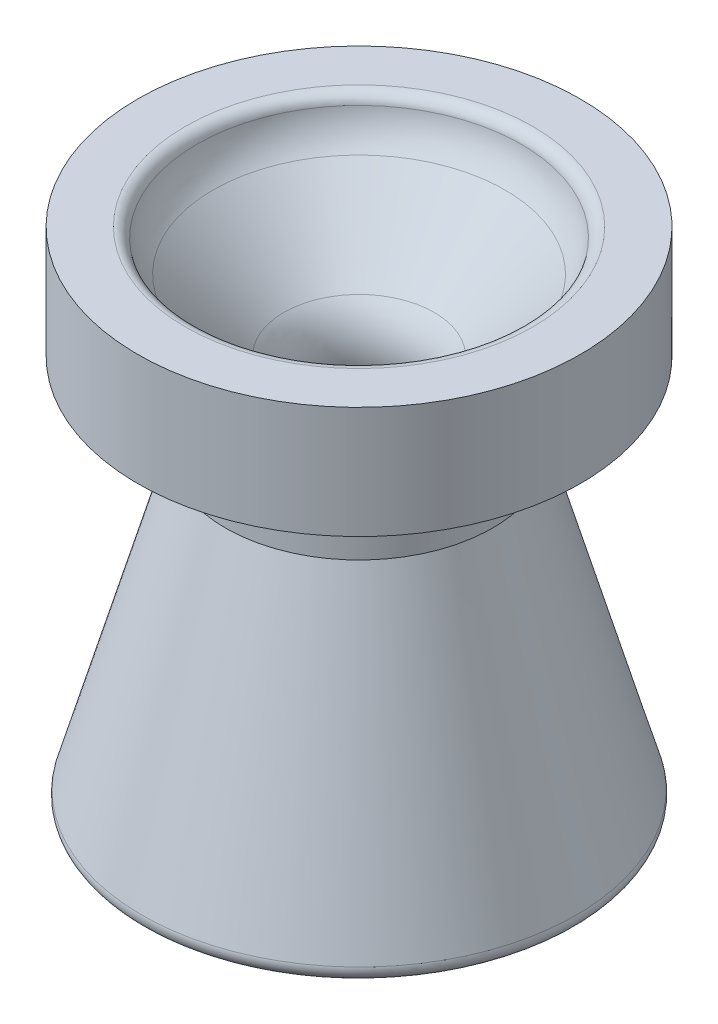
ISO-10303-21;
HEADER;
FILE_DESCRIPTION(('STEP AP214'),'2;1');
FILE_NAME('part.step','',(''),(''),'','','');
FILE_SCHEMA(('AUTOMOTIVE_DESIGN { 1 0 10303 214 1 1 1 1 }'));
ENDSEC;
DATA;
#1=APPLICATION_CONTEXT('core data for automotive mechanical design processes');
#2=APPLICATION_PROTOCOL_DEFINITION('international standard','automotive_design',2000,#1);
#3=PRODUCT_CONTEXT('',#1,'mechanical');
#4=PRODUCT('Part','Part','',(#3));
#5=PRODUCT_RELATED_PRODUCT_CATEGORY('part','',(#4));
#6=PRODUCT_DEFINITION_FORMATION('','',#4);
#7=PRODUCT_DEFINITION_CONTEXT('part definition',#1,'design');
#8=PRODUCT_DEFINITION('design','',#6,#7);
#9=PRODUCT_DEFINITION_SHAPE('','',#8);
#10=(LENGTH_UNIT() NAMED_UNIT(*) SI_UNIT(.MILLI.,.METRE.));
#11=(NAMED_UNIT(*) PLANE_ANGLE_UNIT() SI_UNIT($,.RADIAN.));
#12=(NAMED_UNIT(*) SI_UNIT($,.STERADIAN.) SOLID_ANGLE_UNIT());
#13=UNCERTAINTY_MEASURE_WITH_UNIT(LENGTH_MEASURE(1.E-05),#10,'distance_accuracy_value','');
#14=(GEOMETRIC_REPRESENTATION_CONTEXT(3) GLOBAL_UNCERTAINTY_ASSIGNED_CONTEXT((#13)) GLOBAL_UNIT_ASSIGNED_CONTEXT((#10,
#11,#12)) REPRESENTATION_CONTEXT('',''));
#15=CARTESIAN_POINT('',(0.,0.,0.));
#16=DIRECTION('',(0.,0.,1.));
#17=DIRECTION('',(1.,0.,0.));
#18=AXIS2_PLACEMENT_3D('',#15,#16,#17);
#19=CARTESIAN_POINT('',(0.,-38.1,0.));
#20=DIRECTION('',(0.,1.,0.));
#21=DIRECTION('',(-1.,0.,0.));
#22=AXIS2_PLACEMENT_3D('',#19,#20,#21);
#23=PLANE('',#22);
#24=CARTESIAN_POINT('',(12.7,-38.1,0.));
#25=DIRECTION('',(0.,1.,0.));
#26=DIRECTION('',(-1.,0.,0.));
#27=AXIS2_PLACEMENT_3D('',#24,#25,#26);
#28=CIRCLE('',#27,22.4478970940788);
#29=CARTESIAN_POINT('',(-9.74789709407875,-38.1,0.));
#30=VERTEX_POINT('',#29);
#31=EDGE_CURVE('E10',#30,#30,#28,.F.);
#32=ORIENTED_EDGE('',*,*,#31,.T.);
#33=EDGE_LOOP('',(#32));
#34=FACE_BOUND('',#33,.T.);
#35=CARTESIAN_POINT('',(12.7,-38.1,0.));
#36=DIRECTION('',(0.,1.,0.));
#37=DIRECTION('',(-1.,0.,0.));
#38=AXIS2_PLACEMENT_3D('',#35,#36,#37);
#39=CIRCLE('',#38,17.78);
#40=CARTESIAN_POINT('',(-5.08,-38.1,0.));
#41=VERTEX_POINT('',#40);
#42=EDGE_CURVE('E69',#41,#41,#39,.T.);
#43=ORIENTED_EDGE('',*,*,#42,.T.);
#44=EDGE_LOOP('',(#43));
#45=FACE_BOUND('',#44,.T.);
#46=ADVANCED_FACE('F45',(#34,#45),#23,.F.);
#47=CARTESIAN_POINT('',(546348.662663891,-837588.934241711,0.));
#48=CARTESIAN_POINT('',(-551644.589808928,834072.325765746,0.));
#49=CARTESIAN_POINT('',(556971.334764745,-830563.154592408,0.));
#50=B_SPLINE_CURVE_WITH_KNOTS('',2,(#47,#48,#49),.UNSPECIFIED.,.F.,.F.,(3,3),(0.,1.),.UNSPECIFIED.);
#51=CARTESIAN_POINT('',(12.7,19.6493776314739,0.));
#52=DIRECTION('',(0.,1.,0.));
#53=AXIS1_PLACEMENT('',#51,#52);
#54=SURFACE_OF_REVOLUTION('',#50,#53);
#55=CARTESIAN_POINT('',(12.7,-4.49012806053458,0.));
#56=DIRECTION('',(0.,1.,0.));
#57=DIRECTION('',(-1.,0.,0.));
#58=AXIS2_PLACEMENT_3D('',#55,#56,#57);
#59=CIRCLE('',#58,8.20987193946543);
#60=CARTESIAN_POINT('',(4.49012806053457,-4.49012806053458,0.));
#61=VERTEX_POINT('',#60);
#62=EDGE_CURVE('E73',#61,#61,#59,.T.);
#63=ORIENTED_EDGE('',*,*,#62,.T.);
#64=EDGE_LOOP('',(#63));
#65=FACE_BOUND('',#64,.T.);
#66=ORIENTED_EDGE('',*,*,#42,.F.);
#67=EDGE_LOOP('',(#66));
#68=FACE_BOUND('',#67,.T.);
#69=ADVANCED_FACE('F108',(#65,#68),#54,.F.);
#70=CARTESIAN_POINT('',(12.7,0.,0.));
#71=DIRECTION('',(0.,1.,0.));
#72=DIRECTION('',(-1.,0.,0.));
#73=AXIS2_PLACEMENT_3D('',#70,#71,#72);
#74=TOROIDAL_SURFACE('',#73,12.7,6.35);
#75=ORIENTED_EDGE('',*,*,#62,.F.);
#76=EDGE_LOOP('',(#75));
#77=FACE_BOUND('',#76,.T.);
#78=CARTESIAN_POINT('',(12.7,4.49012806053459,0.));
#79=DIRECTION('',(0.,1.,0.));
#80=DIRECTION('',(-1.,0.,0.));
#81=AXIS2_PLACEMENT_3D('',#78,#79,#80);
#82=CIRCLE('',#81,8.20987193946543);
#83=CARTESIAN_POINT('',(4.49012806053457,4.49012806053458,0.));
#84=VERTEX_POINT('',#83);
#85=EDGE_CURVE('E77',#84,#84,#82,.T.);
#86=ORIENTED_EDGE('',*,*,#85,.T.);
#87=EDGE_LOOP('',(#86));
#88=FACE_BOUND('',#87,.T.);
#89=ADVANCED_FACE('F112',(#77,#88),#74,.T.);
#90=CARTESIAN_POINT('',(12.7,4.49012806053459,0.));
#91=DIRECTION('',(0.,1.,0.));
#92=DIRECTION('',(-1.,0.,0.));
#93=AXIS2_PLACEMENT_3D('',#90,#91,#92);
#94=CONICAL_SURFACE('',#93,8.20987193946543,0.785398163397451);
#95=CARTESIAN_POINT('',(12.7,12.2003841816037,0.));
#96=DIRECTION('',(0.,1.,0.));
#97=DIRECTION('',(-1.,0.,0.));
#98=AXIS2_PLACEMENT_3D('',#95,#96,#97);
#99=CIRCLE('',#98,15.9201280605346);
#100=CARTESIAN_POINT('',(-3.22012806053457,12.2003841816037,0.));
#101=VERTEX_POINT('',#100);
#102=EDGE_CURVE('E81',#101,#101,#99,.T.);
#103=ORIENTED_EDGE('',*,*,#102,.T.);
#104=EDGE_LOOP('',(#103));
#105=FACE_BOUND('',#104,.T.);
#106=ORIENTED_EDGE('',*,*,#85,.F.);
#107=EDGE_LOOP('',(#106));
#108=FACE_BOUND('',#107,.T.);
#109=ADVANCED_FACE('F135',(#105,#108),#94,.F.);
#110=CARTESIAN_POINT('',(12.7,16.6905122421383,0.));
#111=DIRECTION('',(0.,1.,0.));
#112=DIRECTION('',(-1.,0.,0.));
#113=AXIS2_PLACEMENT_3D('',#110,#111,#112);
#114=TOROIDAL_SURFACE('',#113,11.43,6.35);
#115=CARTESIAN_POINT('',(12.7,15.6321789088049,0.));
#116=DIRECTION('',(0.,1.,0.));
#117=DIRECTION('',(-1.,0.,0.));
#118=AXIS2_PLACEMENT_3D('',#115,#116,#117);
#119=CIRCLE('',#118,17.6911844371138);
#120=CARTESIAN_POINT('',(-4.99118443711376,15.6321789088049,0.));
#121=VERTEX_POINT('',#120);
#122=EDGE_CURVE('E63',#121,#121,#119,.T.);
#123=ORIENTED_EDGE('',*,*,#122,.T.);
#124=EDGE_LOOP('',(#123));
#125=FACE_BOUND('',#124,.T.);
#126=ORIENTED_EDGE('',*,*,#102,.F.);
#127=EDGE_LOOP('',(#126));
#128=FACE_BOUND('',#127,.T.);
#129=ADVANCED_FACE('F131',(#125,#128),#114,.F.);
#130=CARTESIAN_POINT('',(0.,16.6905122421383,0.));
#131=DIRECTION('',(0.,-1.,0.));
#132=DIRECTION('',(1.,0.,0.));
#133=AXIS2_PLACEMENT_3D('',#130,#131,#132);
#134=PLANE('',#133);
#135=CARTESIAN_POINT('',(12.7,16.6905122421383,0.));
#136=DIRECTION('',(0.,-1.,0.));
#137=DIRECTION('',(1.,0.,0.));
#138=AXIS2_PLACEMENT_3D('',#135,#136,#137);
#139=CIRCLE('',#138,18.9434213245365);
#140=CARTESIAN_POINT('',(31.6434213245365,16.6905122421383,0.));
#141=VERTEX_POINT('',#140);
#142=EDGE_CURVE('E58',#141,#141,#139,.T.);
#143=ORIENTED_EDGE('',*,*,#142,.T.);
#144=EDGE_LOOP('',(#143));
#145=FACE_BOUND('',#144,.T.);
#146=CARTESIAN_POINT('',(12.7,16.6905122421383,0.));
#147=DIRECTION('',(0.,1.,0.));
#148=DIRECTION('',(-1.,0.,0.));
#149=AXIS2_PLACEMENT_3D('',#146,#147,#148);
#150=CIRCLE('',#149,24.13);
#151=CARTESIAN_POINT('',(-11.43,16.6905122421383,0.));
#152=VERTEX_POINT('',#151);
#153=EDGE_CURVE('E85',#152,#152,#150,.T.);
#154=ORIENTED_EDGE('',*,*,#153,.T.);
#155=EDGE_LOOP('',(#154));
#156=FACE_BOUND('',#155,.T.);
#157=ADVANCED_FACE('F134',(#145,#156),#134,.F.);
#158=CARTESIAN_POINT('',(12.7,19.6493776314739,0.));
#159=DIRECTION('',(0.,1.,0.));
#160=DIRECTION('',(-1.,0.,0.));
#161=AXIS2_PLACEMENT_3D('',#158,#159,#160);
#162=CYLINDRICAL_SURFACE('',#161,24.13);
#163=ORIENTED_EDGE('',*,*,#153,.F.);
#164=EDGE_LOOP('',(#163));
#165=FACE_BOUND('',#164,.T.);
#166=CARTESIAN_POINT('',(12.7,4.49012806053459,0.));
#167=DIRECTION('',(0.,1.,0.));
#168=DIRECTION('',(-1.,0.,0.));
#169=AXIS2_PLACEMENT_3D('',#166,#167,#168);
#170=CIRCLE('',#169,24.13);
#171=CARTESIAN_POINT('',(-11.43,4.49012806053459,0.));
#172=VERTEX_POINT('',#171);
#173=EDGE_CURVE('E89',#172,#172,#170,.T.);
#174=ORIENTED_EDGE('',*,*,#173,.T.);
#175=EDGE_LOOP('',(#174));
#176=FACE_BOUND('',#175,.T.);
#177=ADVANCED_FACE('F163',(#165,#176),#162,.T.);
#178=CARTESIAN_POINT('',(0.,4.49012806053459,0.));
#179=DIRECTION('',(0.,1.,0.));
#180=DIRECTION('',(-1.,0.,0.));
#181=AXIS2_PLACEMENT_3D('',#178,#179,#180);
#182=PLANE('',#181);
#183=ORIENTED_EDGE('',*,*,#173,.F.);
#184=EDGE_LOOP('',(#183));
#185=FACE_BOUND('',#184,.T.);
#186=CARTESIAN_POINT('',(12.7,4.49012806053459,0.));
#187=DIRECTION('',(0.,1.,0.));
#188=DIRECTION('',(-1.,0.,0.));
#189=AXIS2_PLACEMENT_3D('',#186,#187,#188);
#190=CIRCLE('',#189,14.5598719394654);
#191=CARTESIAN_POINT('',(-1.85987193946543,4.49012806053459,0.));
#192=VERTEX_POINT('',#191);
#193=EDGE_CURVE('E93',#192,#192,#190,.T.);
#194=ORIENTED_EDGE('',*,*,#193,.T.);
#195=EDGE_LOOP('',(#194));
#196=FACE_BOUND('',#195,.T.);
#197=ADVANCED_FACE('F167',(#185,#196),#182,.F.);
#198=CARTESIAN_POINT('',(12.7,19.6493776314739,0.));
#199=DIRECTION('',(0.,1.,0.));
#200=DIRECTION('',(-1.,0.,0.));
#201=AXIS2_PLACEMENT_3D('',#198,#199,#200);
#202=CYLINDRICAL_SURFACE('',#201,14.5598719394654);
#203=CARTESIAN_POINT('',(12.7,-4.49012806053458,0.));
#204=DIRECTION('',(0.,1.,0.));
#205=DIRECTION('',(-1.,0.,0.));
#206=AXIS2_PLACEMENT_3D('',#203,#204,#205);
#207=CIRCLE('',#206,14.5598719394654);
#208=CARTESIAN_POINT('',(-1.85987193946543,-4.49012806053459,0.));
#209=VERTEX_POINT('',#208);
#210=EDGE_CURVE('E97',#209,#209,#207,.T.);
#211=ORIENTED_EDGE('',*,*,#210,.T.);
#212=EDGE_LOOP('',(#211));
#213=FACE_BOUND('',#212,.T.);
#214=ORIENTED_EDGE('',*,*,#193,.F.);
#215=EDGE_LOOP('',(#214));
#216=FACE_BOUND('',#215,.T.);
#217=ADVANCED_FACE('F125',(#213,#216),#202,.T.);
#218=CARTESIAN_POINT('',(12.7,-38.1,0.));
#219=DIRECTION('',(0.,-1.,0.));
#220=DIRECTION('',(1.,0.,0.));
#221=AXIS2_PLACEMENT_3D('',#218,#219,#220);
#222=CONICAL_SURFACE('',#221,24.13,0.277400134735495);
#223=CARTESIAN_POINT('',(12.7,-36.4822027495166,0.));
#224=DIRECTION('',(0.,1.,0.));
#225=DIRECTION('',(-1.,0.,0.));
#226=AXIS2_PLACEMENT_3D('',#223,#224,#225);
#227=CIRCLE('',#226,23.669345853772);
#228=CARTESIAN_POINT('',(-10.969345853772,-36.4822027495166,0.));
#229=VERTEX_POINT('',#228);
#230=EDGE_CURVE('E53',#229,#229,#227,.T.);
#231=ORIENTED_EDGE('',*,*,#230,.T.);
#232=EDGE_LOOP('',(#231));
#233=FACE_BOUND('',#232,.T.);
#234=ORIENTED_EDGE('',*,*,#210,.F.);
#235=EDGE_LOOP('',(#234));
#236=FACE_BOUND('',#235,.T.);
#237=ADVANCED_FACE('F118',(#233,#236),#222,.T.);
#238=CARTESIAN_POINT('',(12.7,15.4205122421383,0.));
#239=DIRECTION('',(0.,-1.,0.));
#240=DIRECTION('',(1.,0.,0.));
#241=AXIS2_PLACEMENT_3D('',#238,#239,#240);
#242=TOROIDAL_SURFACE('',#241,18.9434213245365,1.27);
#243=ORIENTED_EDGE('',*,*,#142,.F.);
#244=EDGE_LOOP('',(#243));
#245=FACE_BOUND('',#244,.T.);
#246=ORIENTED_EDGE('',*,*,#122,.F.);
#247=EDGE_LOOP('',(#246));
#248=FACE_BOUND('',#247,.T.);
#249=ADVANCED_FACE('F116',(#245,#248),#242,.T.);
#250=CARTESIAN_POINT('',(12.7,-36.83,0.));
#251=DIRECTION('',(0.,1.,0.));
#252=DIRECTION('',(-1.,0.,0.));
#253=AXIS2_PLACEMENT_3D('',#250,#251,#252);
#254=TOROIDAL_SURFACE('',#253,22.4478970940788,1.27);
#255=ORIENTED_EDGE('',*,*,#31,.F.);
#256=EDGE_LOOP('',(#255));
#257=FACE_BOUND('',#256,.T.);
#258=ORIENTED_EDGE('',*,*,#230,.F.);
#259=EDGE_LOOP('',(#258));
#260=FACE_BOUND('',#259,.T.);
#261=ADVANCED_FACE('F47',(#257,#260),#254,.T.);
#262=CLOSED_SHELL('',(#46,#69,#89,#109,#129,#157,#177,#197,#217,#237,#249,#261));
#263=MANIFOLD_SOLID_BREP('B2',#262);
#264=ADVANCED_BREP_SHAPE_REPRESENTATION('',(#18,#263),#14);
#265=SHAPE_DEFINITION_REPRESENTATION(#9,#264);
ENDSEC;
END-ISO-10303-21;
